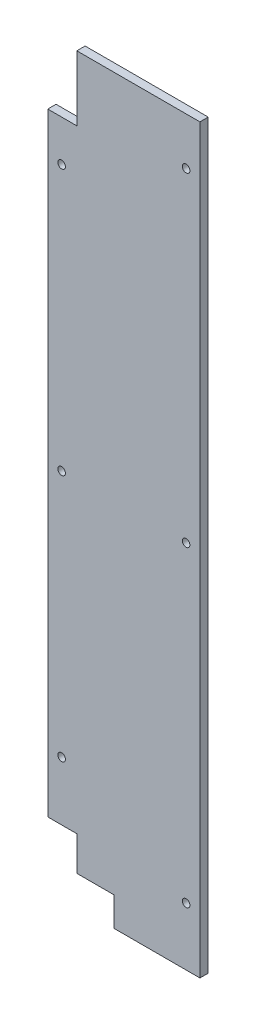
ISO-10303-21;
HEADER;
FILE_DESCRIPTION(('STEP AP214'),'2;1');
FILE_NAME('part.step','',(''),(''),'','','');
FILE_SCHEMA(('AUTOMOTIVE_DESIGN { 1 0 10303 214 1 1 1 1 }'));
ENDSEC;
DATA;
#1=APPLICATION_CONTEXT('core data for automotive mechanical design processes');
#2=APPLICATION_PROTOCOL_DEFINITION('international standard','automotive_design',2000,#1);
#3=PRODUCT_CONTEXT('',#1,'mechanical');
#4=PRODUCT('Part','Part','',(#3));
#5=PRODUCT_RELATED_PRODUCT_CATEGORY('part','',(#4));
#6=PRODUCT_DEFINITION_FORMATION('','',#4);
#7=PRODUCT_DEFINITION_CONTEXT('part definition',#1,'design');
#8=PRODUCT_DEFINITION('design','',#6,#7);
#9=PRODUCT_DEFINITION_SHAPE('','',#8);
#10=(LENGTH_UNIT() NAMED_UNIT(*) SI_UNIT(.MILLI.,.METRE.));
#11=(NAMED_UNIT(*) PLANE_ANGLE_UNIT() SI_UNIT($,.RADIAN.));
#12=(NAMED_UNIT(*) SI_UNIT($,.STERADIAN.) SOLID_ANGLE_UNIT());
#13=UNCERTAINTY_MEASURE_WITH_UNIT(LENGTH_MEASURE(1.E-05),#10,'distance_accuracy_value','');
#14=(GEOMETRIC_REPRESENTATION_CONTEXT(3) GLOBAL_UNCERTAINTY_ASSIGNED_CONTEXT((#13)) GLOBAL_UNIT_ASSIGNED_CONTEXT((#10,
#11,#12)) REPRESENTATION_CONTEXT('',''));
#15=CARTESIAN_POINT('',(0.,0.,0.));
#16=DIRECTION('',(0.,0.,1.));
#17=DIRECTION('',(1.,0.,0.));
#18=AXIS2_PLACEMENT_3D('',#15,#16,#17);
#19=CARTESIAN_POINT('',(-109.419020992965,162.175301007237,6.));
#20=DIRECTION('',(-1.,0.,0.));
#21=DIRECTION('',(0.,-1.,0.));
#22=AXIS2_PLACEMENT_3D('',#19,#20,#21);
#23=PLANE('',#22);
#24=DIRECTION('',(0.,1.,0.));
#25=VECTOR('',#24,1.);
#26=CARTESIAN_POINT('',(-109.419020992965,162.175301007237,0.));
#27=LINE('',#26,#25);
#28=CARTESIAN_POINT('',(-109.419020992965,162.175301007237,0.));
#29=VERTEX_POINT('',#28);
#30=CARTESIAN_POINT('',(-109.419020992965,209.144261643741,0.));
#31=VERTEX_POINT('',#30);
#32=EDGE_CURVE('E142',#29,#31,#27,.T.);
#33=ORIENTED_EDGE('',*,*,#32,.F.);
#34=DIRECTION('',(0.,0.,-1.));
#35=VECTOR('',#34,1.);
#36=CARTESIAN_POINT('',(-109.419020992965,162.175301007237,6.));
#37=LINE('',#36,#35);
#38=CARTESIAN_POINT('',(-109.419020992965,162.175301007237,6.));
#39=VERTEX_POINT('',#38);
#40=EDGE_CURVE('E11',#39,#29,#37,.T.);
#41=ORIENTED_EDGE('',*,*,#40,.F.);
#42=DIRECTION('',(0.,1.,0.));
#43=VECTOR('',#42,1.);
#44=CARTESIAN_POINT('',(-109.419020992965,162.175301007237,6.));
#45=LINE('',#44,#43);
#46=CARTESIAN_POINT('',(-109.419020992965,209.144261643741,6.));
#47=VERTEX_POINT('',#46);
#48=EDGE_CURVE('E169',#39,#47,#45,.T.);
#49=ORIENTED_EDGE('',*,*,#48,.T.);
#50=DIRECTION('',(0.,0.,-1.));
#51=VECTOR('',#50,1.);
#52=CARTESIAN_POINT('',(-109.419020992965,209.144261643741,6.));
#53=LINE('',#52,#51);
#54=EDGE_CURVE('E94',#47,#31,#53,.T.);
#55=ORIENTED_EDGE('',*,*,#54,.T.);
#56=EDGE_LOOP('',(#33,#41,#49,#55));
#57=FACE_BOUND('',#56,.T.);
#58=ADVANCED_FACE('F33',(#57),#23,.T.);
#59=CARTESIAN_POINT('',(-130.419020992965,162.175301007237,6.));
#60=DIRECTION('',(0.,1.,0.));
#61=DIRECTION('',(0.,0.,1.));
#62=AXIS2_PLACEMENT_3D('',#59,#60,#61);
#63=PLANE('',#62);
#64=DIRECTION('',(1.,0.,0.));
#65=VECTOR('',#64,1.);
#66=CARTESIAN_POINT('',(-130.419020992965,162.175301007237,0.));
#67=LINE('',#66,#65);
#68=CARTESIAN_POINT('',(-130.419020992965,162.175301007237,0.));
#69=VERTEX_POINT('',#68);
#70=EDGE_CURVE('E167',#69,#29,#67,.T.);
#71=ORIENTED_EDGE('',*,*,#70,.F.);
#72=DIRECTION('',(0.,0.,-1.));
#73=VECTOR('',#72,1.);
#74=CARTESIAN_POINT('',(-130.419020992965,162.175301007237,6.));
#75=LINE('',#74,#73);
#76=CARTESIAN_POINT('',(-130.419020992965,162.175301007237,6.));
#77=VERTEX_POINT('',#76);
#78=EDGE_CURVE('E42',#77,#69,#75,.T.);
#79=ORIENTED_EDGE('',*,*,#78,.F.);
#80=DIRECTION('',(1.,0.,0.));
#81=VECTOR('',#80,1.);
#82=CARTESIAN_POINT('',(-130.419020992965,162.175301007237,6.));
#83=LINE('',#82,#81);
#84=EDGE_CURVE('E122',#77,#39,#83,.T.);
#85=ORIENTED_EDGE('',*,*,#84,.T.);
#86=ORIENTED_EDGE('',*,*,#40,.T.);
#87=EDGE_LOOP('',(#71,#79,#85,#86));
#88=FACE_BOUND('',#87,.T.);
#89=ADVANCED_FACE('F243',(#88),#63,.T.);
#90=CARTESIAN_POINT('',(-130.419020992965,162.175301007237,6.));
#91=DIRECTION('',(1.,0.,0.));
#92=DIRECTION('',(0.,1.,0.));
#93=AXIS2_PLACEMENT_3D('',#90,#91,#92);
#94=PLANE('',#93);
#95=DIRECTION('',(0.,-1.,0.));
#96=VECTOR('',#95,1.);
#97=CARTESIAN_POINT('',(-130.419020992965,162.175301007237,0.));
#98=LINE('',#97,#96);
#99=CARTESIAN_POINT('',(-130.419020992965,-281.026923500086,0.));
#100=VERTEX_POINT('',#99);
#101=EDGE_CURVE('E127',#69,#100,#98,.T.);
#102=ORIENTED_EDGE('',*,*,#101,.T.);
#103=DIRECTION('',(0.,0.,-1.));
#104=VECTOR('',#103,1.);
#105=CARTESIAN_POINT('',(-130.419020992965,-281.026923500086,6.));
#106=LINE('',#105,#104);
#107=CARTESIAN_POINT('',(-130.419020992965,-281.026923500086,6.));
#108=VERTEX_POINT('',#107);
#109=EDGE_CURVE('E125',#108,#100,#106,.T.);
#110=ORIENTED_EDGE('',*,*,#109,.F.);
#111=DIRECTION('',(0.,-1.,0.));
#112=VECTOR('',#111,1.);
#113=CARTESIAN_POINT('',(-130.419020992965,162.175301007237,6.));
#114=LINE('',#113,#112);
#115=EDGE_CURVE('E116',#77,#108,#114,.T.);
#116=ORIENTED_EDGE('',*,*,#115,.F.);
#117=ORIENTED_EDGE('',*,*,#78,.T.);
#118=EDGE_LOOP('',(#102,#110,#116,#117));
#119=FACE_BOUND('',#118,.T.);
#120=ADVANCED_FACE('F126',(#119),#94,.F.);
#121=CARTESIAN_POINT('',(-130.419020992965,-281.026923500086,6.));
#122=DIRECTION('',(0.,1.,0.));
#123=DIRECTION('',(-1.,0.,0.));
#124=AXIS2_PLACEMENT_3D('',#121,#122,#123);
#125=PLANE('',#124);
#126=DIRECTION('',(1.,0.,0.));
#127=VECTOR('',#126,1.);
#128=CARTESIAN_POINT('',(-130.419020992965,-281.026923500086,0.));
#129=LINE('',#128,#127);
#130=CARTESIAN_POINT('',(-109.419020992965,-281.026923500086,0.));
#131=VERTEX_POINT('',#130);
#132=EDGE_CURVE('E164',#100,#131,#129,.T.);
#133=ORIENTED_EDGE('',*,*,#132,.T.);
#134=DIRECTION('',(0.,0.,-1.));
#135=VECTOR('',#134,1.);
#136=CARTESIAN_POINT('',(-109.419020992965,-281.026923500086,6.));
#137=LINE('',#136,#135);
#138=CARTESIAN_POINT('',(-109.419020992965,-281.026923500086,6.));
#139=VERTEX_POINT('',#138);
#140=EDGE_CURVE('E130',#139,#131,#137,.T.);
#141=ORIENTED_EDGE('',*,*,#140,.F.);
#142=DIRECTION('',(1.,0.,0.));
#143=VECTOR('',#142,1.);
#144=CARTESIAN_POINT('',(-130.419020992965,-281.026923500086,6.));
#145=LINE('',#144,#143);
#146=EDGE_CURVE('E120',#108,#139,#145,.T.);
#147=ORIENTED_EDGE('',*,*,#146,.F.);
#148=ORIENTED_EDGE('',*,*,#109,.T.);
#149=EDGE_LOOP('',(#133,#141,#147,#148));
#150=FACE_BOUND('',#149,.T.);
#151=ADVANCED_FACE('F132',(#150),#125,.F.);
#152=CARTESIAN_POINT('',(-109.419020992965,-281.026923500086,6.));
#153=DIRECTION('',(1.,0.,0.));
#154=DIRECTION('',(0.,0.,-1.));
#155=AXIS2_PLACEMENT_3D('',#152,#153,#154);
#156=PLANE('',#155);
#157=DIRECTION('',(0.,-1.,0.));
#158=VECTOR('',#157,1.);
#159=CARTESIAN_POINT('',(-109.419020992965,-281.026923500086,0.));
#160=LINE('',#159,#158);
#161=CARTESIAN_POINT('',(-109.419020992965,-305.855738356259,0.));
#162=VERTEX_POINT('',#161);
#163=EDGE_CURVE('E161',#131,#162,#160,.T.);
#164=ORIENTED_EDGE('',*,*,#163,.T.);
#165=DIRECTION('',(0.,0.,-1.));
#166=VECTOR('',#165,1.);
#167=CARTESIAN_POINT('',(-109.419020992965,-305.855738356259,6.));
#168=LINE('',#167,#166);
#169=CARTESIAN_POINT('',(-109.419020992965,-305.855738356259,6.));
#170=VERTEX_POINT('',#169);
#171=EDGE_CURVE('E173',#170,#162,#168,.T.);
#172=ORIENTED_EDGE('',*,*,#171,.F.);
#173=DIRECTION('',(0.,-1.,0.));
#174=VECTOR('',#173,1.);
#175=CARTESIAN_POINT('',(-109.419020992965,-281.026923500086,6.));
#176=LINE('',#175,#174);
#177=EDGE_CURVE('E135',#139,#170,#176,.T.);
#178=ORIENTED_EDGE('',*,*,#177,.F.);
#179=ORIENTED_EDGE('',*,*,#140,.T.);
#180=EDGE_LOOP('',(#164,#172,#178,#179));
#181=FACE_BOUND('',#180,.T.);
#182=ADVANCED_FACE('F256',(#181),#156,.F.);
#183=CARTESIAN_POINT('',(-82.4190209929646,-305.855738356259,6.));
#184=DIRECTION('',(0.,-1.,0.));
#185=DIRECTION('',(0.,0.,-1.));
#186=AXIS2_PLACEMENT_3D('',#183,#184,#185);
#187=PLANE('',#186);
#188=DIRECTION('',(-1.,0.,0.));
#189=VECTOR('',#188,1.);
#190=CARTESIAN_POINT('',(-82.4190209929646,-305.855738356259,0.));
#191=LINE('',#190,#189);
#192=CARTESIAN_POINT('',(-82.4190209929646,-305.855738356259,0.));
#193=VERTEX_POINT('',#192);
#194=EDGE_CURVE('E158',#193,#162,#191,.T.);
#195=ORIENTED_EDGE('',*,*,#194,.F.);
#196=DIRECTION('',(0.,0.,-1.));
#197=VECTOR('',#196,1.);
#198=CARTESIAN_POINT('',(-82.4190209929646,-305.855738356259,6.));
#199=LINE('',#198,#197);
#200=CARTESIAN_POINT('',(-82.4190209929646,-305.855738356259,6.));
#201=VERTEX_POINT('',#200);
#202=EDGE_CURVE('E175',#201,#193,#199,.T.);
#203=ORIENTED_EDGE('',*,*,#202,.F.);
#204=DIRECTION('',(-1.,0.,0.));
#205=VECTOR('',#204,1.);
#206=CARTESIAN_POINT('',(-82.4190209929646,-305.855738356259,6.));
#207=LINE('',#206,#205);
#208=EDGE_CURVE('E137',#201,#170,#207,.T.);
#209=ORIENTED_EDGE('',*,*,#208,.T.);
#210=ORIENTED_EDGE('',*,*,#171,.T.);
#211=EDGE_LOOP('',(#195,#203,#209,#210));
#212=FACE_BOUND('',#211,.T.);
#213=ADVANCED_FACE('F225',(#212),#187,.T.);
#214=CARTESIAN_POINT('',(-82.4190209929646,-326.855738356259,6.));
#215=DIRECTION('',(-1.,0.,0.));
#216=DIRECTION('',(0.,-1.,0.));
#217=AXIS2_PLACEMENT_3D('',#214,#215,#216);
#218=PLANE('',#217);
#219=DIRECTION('',(0.,1.,0.));
#220=VECTOR('',#219,1.);
#221=CARTESIAN_POINT('',(-82.4190209929646,-326.855738356259,0.));
#222=LINE('',#221,#220);
#223=CARTESIAN_POINT('',(-82.4190209929646,-326.855738356259,0.));
#224=VERTEX_POINT('',#223);
#225=EDGE_CURVE('E155',#224,#193,#222,.T.);
#226=ORIENTED_EDGE('',*,*,#225,.F.);
#227=DIRECTION('',(0.,0.,-1.));
#228=VECTOR('',#227,1.);
#229=CARTESIAN_POINT('',(-82.4190209929646,-326.855738356259,6.));
#230=LINE('',#229,#228);
#231=CARTESIAN_POINT('',(-82.4190209929646,-326.855738356259,6.));
#232=VERTEX_POINT('',#231);
#233=EDGE_CURVE('E177',#232,#224,#230,.T.);
#234=ORIENTED_EDGE('',*,*,#233,.F.);
#235=DIRECTION('',(0.,1.,0.));
#236=VECTOR('',#235,1.);
#237=CARTESIAN_POINT('',(-82.4190209929646,-326.855738356259,6.));
#238=LINE('',#237,#236);
#239=EDGE_CURVE('E219',#232,#201,#238,.T.);
#240=ORIENTED_EDGE('',*,*,#239,.T.);
#241=ORIENTED_EDGE('',*,*,#202,.T.);
#242=EDGE_LOOP('',(#226,#234,#240,#241));
#243=FACE_BOUND('',#242,.T.);
#244=ADVANCED_FACE('F230',(#243),#218,.T.);
#245=CARTESIAN_POINT('',(-82.4190209929646,-326.855738356259,6.));
#246=DIRECTION('',(0.,1.,0.));
#247=DIRECTION('',(0.,0.,1.));
#248=AXIS2_PLACEMENT_3D('',#245,#246,#247);
#249=PLANE('',#248);
#250=DIRECTION('',(1.,0.,0.));
#251=VECTOR('',#250,1.);
#252=CARTESIAN_POINT('',(-82.4190209929646,-326.855738356259,0.));
#253=LINE('',#252,#251);
#254=CARTESIAN_POINT('',(-20.4190209929647,-326.855738356259,0.));
#255=VERTEX_POINT('',#254);
#256=EDGE_CURVE('E152',#224,#255,#253,.T.);
#257=ORIENTED_EDGE('',*,*,#256,.T.);
#258=DIRECTION('',(0.,0.,-1.));
#259=VECTOR('',#258,1.);
#260=CARTESIAN_POINT('',(-20.4190209929647,-326.855738356259,6.));
#261=LINE('',#260,#259);
#262=CARTESIAN_POINT('',(-20.4190209929647,-326.855738356259,6.));
#263=VERTEX_POINT('',#262);
#264=EDGE_CURVE('E179',#263,#255,#261,.T.);
#265=ORIENTED_EDGE('',*,*,#264,.F.);
#266=DIRECTION('',(1.,0.,0.));
#267=VECTOR('',#266,1.);
#268=CARTESIAN_POINT('',(-82.4190209929646,-326.855738356259,6.));
#269=LINE('',#268,#267);
#270=EDGE_CURVE('E217',#232,#263,#269,.T.);
#271=ORIENTED_EDGE('',*,*,#270,.F.);
#272=ORIENTED_EDGE('',*,*,#233,.T.);
#273=EDGE_LOOP('',(#257,#265,#271,#272));
#274=FACE_BOUND('',#273,.T.);
#275=ADVANCED_FACE('F235',(#274),#249,.F.);
#276=CARTESIAN_POINT('',(-20.4190209929647,209.144261643741,6.));
#277=DIRECTION('',(1.,0.,0.));
#278=DIRECTION('',(0.,0.,-1.));
#279=AXIS2_PLACEMENT_3D('',#276,#277,#278);
#280=PLANE('',#279);
#281=DIRECTION('',(0.,-1.,0.));
#282=VECTOR('',#281,1.);
#283=CARTESIAN_POINT('',(-20.4190209929647,209.144261643741,0.));
#284=LINE('',#283,#282);
#285=CARTESIAN_POINT('',(-20.4190209929647,209.144261643741,0.));
#286=VERTEX_POINT('',#285);
#287=EDGE_CURVE('E149',#286,#255,#284,.T.);
#288=ORIENTED_EDGE('',*,*,#287,.F.);
#289=DIRECTION('',(0.,0.,-1.));
#290=VECTOR('',#289,1.);
#291=CARTESIAN_POINT('',(-20.4190209929647,209.144261643741,6.));
#292=LINE('',#291,#290);
#293=CARTESIAN_POINT('',(-20.4190209929647,209.144261643741,6.));
#294=VERTEX_POINT('',#293);
#295=EDGE_CURVE('E181',#294,#286,#292,.T.);
#296=ORIENTED_EDGE('',*,*,#295,.F.);
#297=DIRECTION('',(0.,-1.,0.));
#298=VECTOR('',#297,1.);
#299=CARTESIAN_POINT('',(-20.4190209929647,209.144261643741,6.));
#300=LINE('',#299,#298);
#301=EDGE_CURVE('E214',#294,#263,#300,.T.);
#302=ORIENTED_EDGE('',*,*,#301,.T.);
#303=ORIENTED_EDGE('',*,*,#264,.T.);
#304=EDGE_LOOP('',(#288,#296,#302,#303));
#305=FACE_BOUND('',#304,.T.);
#306=ADVANCED_FACE('F240',(#305),#280,.T.);
#307=CARTESIAN_POINT('',(-109.419020992965,209.144261643741,6.));
#308=DIRECTION('',(0.,1.,0.));
#309=DIRECTION('',(0.,0.,1.));
#310=AXIS2_PLACEMENT_3D('',#307,#308,#309);
#311=PLANE('',#310);
#312=DIRECTION('',(1.,0.,0.));
#313=VECTOR('',#312,1.);
#314=CARTESIAN_POINT('',(-109.419020992965,209.144261643741,0.));
#315=LINE('',#314,#313);
#316=EDGE_CURVE('E145',#31,#286,#315,.T.);
#317=ORIENTED_EDGE('',*,*,#316,.F.);
#318=ORIENTED_EDGE('',*,*,#54,.F.);
#319=DIRECTION('',(1.,0.,0.));
#320=VECTOR('',#319,1.);
#321=CARTESIAN_POINT('',(-109.419020992965,209.144261643741,6.));
#322=LINE('',#321,#320);
#323=EDGE_CURVE('E212',#47,#294,#322,.T.);
#324=ORIENTED_EDGE('',*,*,#323,.T.);
#325=ORIENTED_EDGE('',*,*,#295,.T.);
#326=EDGE_LOOP('',(#317,#318,#324,#325));
#327=FACE_BOUND('',#326,.T.);
#328=ADVANCED_FACE('F238',(#327),#311,.T.);
#329=CARTESIAN_POINT('',(0.,0.,6.));
#330=DIRECTION('',(0.,0.,-1.));
#331=DIRECTION('',(-1.,0.,0.));
#332=AXIS2_PLACEMENT_3D('',#329,#330,#331);
#333=PLANE('',#332);
#334=CARTESIAN_POINT('',(-120.419020992965,132.455525642704,6.));
#335=DIRECTION('',(0.,0.,1.));
#336=DIRECTION('',(1.,0.,0.));
#337=AXIS2_PLACEMENT_3D('',#334,#335,#336);
#338=CIRCLE('',#337,2.75000000000001);
#339=CARTESIAN_POINT('',(-117.669020992965,132.455525642704,6.));
#340=VERTEX_POINT('',#339);
#341=EDGE_CURVE('E312',#340,#340,#338,.T.);
#342=ORIENTED_EDGE('',*,*,#341,.F.);
#343=EDGE_LOOP('',(#342));
#344=FACE_BOUND('',#343,.T.);
#345=CARTESIAN_POINT('',(-120.419020992965,-238.562803654392,6.));
#346=DIRECTION('',(0.,0.,1.));
#347=DIRECTION('',(1.,0.,0.));
#348=AXIS2_PLACEMENT_3D('',#345,#346,#347);
#349=CIRCLE('',#348,2.75000000000001);
#350=CARTESIAN_POINT('',(-117.669020992965,-238.562803654392,6.));
#351=VERTEX_POINT('',#350);
#352=EDGE_CURVE('E308',#351,#351,#349,.T.);
#353=ORIENTED_EDGE('',*,*,#352,.F.);
#354=EDGE_LOOP('',(#353));
#355=FACE_BOUND('',#354,.T.);
#356=CARTESIAN_POINT('',(-30.4190209929647,-284.937648355611,6.));
#357=DIRECTION('',(0.,0.,1.));
#358=DIRECTION('',(1.,0.,0.));
#359=AXIS2_PLACEMENT_3D('',#356,#357,#358);
#360=CIRCLE('',#359,2.75);
#361=CARTESIAN_POINT('',(-27.6690209929647,-284.937648355611,6.));
#362=VERTEX_POINT('',#361);
#363=EDGE_CURVE('E306',#362,#362,#360,.T.);
#364=ORIENTED_EDGE('',*,*,#363,.F.);
#365=EDGE_LOOP('',(#364));
#366=FACE_BOUND('',#365,.T.);
#367=CARTESIAN_POINT('',(-30.4190209929647,174.944215351791,6.));
#368=DIRECTION('',(0.,0.,1.));
#369=DIRECTION('',(1.,0.,0.));
#370=AXIS2_PLACEMENT_3D('',#367,#368,#369);
#371=CIRCLE('',#370,2.75);
#372=CARTESIAN_POINT('',(-27.6690209929647,174.944215351791,6.));
#373=VERTEX_POINT('',#372);
#374=EDGE_CURVE('E209',#373,#373,#371,.T.);
#375=ORIENTED_EDGE('',*,*,#374,.F.);
#376=EDGE_LOOP('',(#375));
#377=FACE_BOUND('',#376,.T.);
#378=CARTESIAN_POINT('',(-30.4190209929647,-59.4258112464244,6.));
#379=DIRECTION('',(0.,0.,1.));
#380=DIRECTION('',(1.,0.,0.));
#381=AXIS2_PLACEMENT_3D('',#378,#379,#380);
#382=CIRCLE('',#381,2.75);
#383=CARTESIAN_POINT('',(-27.6690209929647,-59.4258112464244,6.));
#384=VERTEX_POINT('',#383);
#385=EDGE_CURVE('E191',#384,#384,#382,.T.);
#386=ORIENTED_EDGE('',*,*,#385,.F.);
#387=EDGE_LOOP('',(#386));
#388=FACE_BOUND('',#387,.T.);
#389=CARTESIAN_POINT('',(-120.419020992965,-59.4258112464244,6.));
#390=DIRECTION('',(0.,0.,1.));
#391=DIRECTION('',(1.,0.,0.));
#392=AXIS2_PLACEMENT_3D('',#389,#390,#391);
#393=CIRCLE('',#392,2.75000000000001);
#394=CARTESIAN_POINT('',(-117.669020992965,-59.4258112464244,6.));
#395=VERTEX_POINT('',#394);
#396=EDGE_CURVE('E186',#395,#395,#393,.T.);
#397=ORIENTED_EDGE('',*,*,#396,.F.);
#398=EDGE_LOOP('',(#397));
#399=FACE_BOUND('',#398,.T.);
#400=ORIENTED_EDGE('',*,*,#48,.F.);
#401=ORIENTED_EDGE('',*,*,#84,.F.);
#402=ORIENTED_EDGE('',*,*,#115,.T.);
#403=ORIENTED_EDGE('',*,*,#146,.T.);
#404=ORIENTED_EDGE('',*,*,#177,.T.);
#405=ORIENTED_EDGE('',*,*,#208,.F.);
#406=ORIENTED_EDGE('',*,*,#239,.F.);
#407=ORIENTED_EDGE('',*,*,#270,.T.);
#408=ORIENTED_EDGE('',*,*,#301,.F.);
#409=ORIENTED_EDGE('',*,*,#323,.F.);
#410=EDGE_LOOP('',(#400,#401,#402,#403,#404,#405,#406,#407,#408,#409));
#411=FACE_BOUND('',#410,.T.);
#412=ADVANCED_FACE('F118',(#344,#355,#366,#377,#388,#399,#411),#333,.F.);
#413=CARTESIAN_POINT('',(0.,0.,0.));
#414=DIRECTION('',(0.,0.,-1.));
#415=DIRECTION('',(-1.,0.,0.));
#416=AXIS2_PLACEMENT_3D('',#413,#414,#415);
#417=PLANE('',#416);
#418=CARTESIAN_POINT('',(-120.419020992965,132.455525642704,0.));
#419=DIRECTION('',(0.,0.,-1.));
#420=DIRECTION('',(-1.,0.,0.));
#421=AXIS2_PLACEMENT_3D('',#418,#419,#420);
#422=CIRCLE('',#421,2.75000000000001);
#423=CARTESIAN_POINT('',(-123.169020992965,132.455525642704,0.));
#424=VERTEX_POINT('',#423);
#425=EDGE_CURVE('E36',#424,#424,#422,.T.);
#426=ORIENTED_EDGE('',*,*,#425,.F.);
#427=EDGE_LOOP('',(#426));
#428=FACE_BOUND('',#427,.T.);
#429=CARTESIAN_POINT('',(-120.419020992965,-238.562803654392,0.));
#430=DIRECTION('',(0.,0.,-1.));
#431=DIRECTION('',(-1.,0.,0.));
#432=AXIS2_PLACEMENT_3D('',#429,#430,#431);
#433=CIRCLE('',#432,2.75000000000001);
#434=CARTESIAN_POINT('',(-123.169020992965,-238.562803654392,0.));
#435=VERTEX_POINT('',#434);
#436=EDGE_CURVE('E196',#435,#435,#433,.T.);
#437=ORIENTED_EDGE('',*,*,#436,.F.);
#438=EDGE_LOOP('',(#437));
#439=FACE_BOUND('',#438,.T.);
#440=CARTESIAN_POINT('',(-30.4190209929647,-284.937648355611,0.));
#441=DIRECTION('',(0.,0.,-1.));
#442=DIRECTION('',(-1.,0.,0.));
#443=AXIS2_PLACEMENT_3D('',#440,#441,#442);
#444=CIRCLE('',#443,2.75);
#445=CARTESIAN_POINT('',(-33.1690209929647,-284.937648355611,0.));
#446=VERTEX_POINT('',#445);
#447=EDGE_CURVE('E194',#446,#446,#444,.T.);
#448=ORIENTED_EDGE('',*,*,#447,.F.);
#449=EDGE_LOOP('',(#448));
#450=FACE_BOUND('',#449,.T.);
#451=CARTESIAN_POINT('',(-30.4190209929647,174.944215351791,0.));
#452=DIRECTION('',(0.,0.,-1.));
#453=DIRECTION('',(-1.,0.,0.));
#454=AXIS2_PLACEMENT_3D('',#451,#452,#453);
#455=CIRCLE('',#454,2.75);
#456=CARTESIAN_POINT('',(-33.1690209929647,174.944215351791,0.));
#457=VERTEX_POINT('',#456);
#458=EDGE_CURVE('E190',#457,#457,#455,.T.);
#459=ORIENTED_EDGE('',*,*,#458,.F.);
#460=EDGE_LOOP('',(#459));
#461=FACE_BOUND('',#460,.T.);
#462=CARTESIAN_POINT('',(-30.4190209929647,-59.4258112464244,0.));
#463=DIRECTION('',(0.,0.,-1.));
#464=DIRECTION('',(-1.,0.,0.));
#465=AXIS2_PLACEMENT_3D('',#462,#463,#464);
#466=CIRCLE('',#465,2.75);
#467=CARTESIAN_POINT('',(-33.1690209929647,-59.4258112464244,0.));
#468=VERTEX_POINT('',#467);
#469=EDGE_CURVE('E187',#468,#468,#466,.T.);
#470=ORIENTED_EDGE('',*,*,#469,.F.);
#471=EDGE_LOOP('',(#470));
#472=FACE_BOUND('',#471,.T.);
#473=CARTESIAN_POINT('',(-120.419020992965,-59.4258112464244,0.));
#474=DIRECTION('',(0.,0.,-1.));
#475=DIRECTION('',(-1.,0.,0.));
#476=AXIS2_PLACEMENT_3D('',#473,#474,#475);
#477=CIRCLE('',#476,2.75000000000001);
#478=CARTESIAN_POINT('',(-123.169020992965,-59.4258112464244,0.));
#479=VERTEX_POINT('',#478);
#480=EDGE_CURVE('E146',#479,#479,#477,.T.);
#481=ORIENTED_EDGE('',*,*,#480,.F.);
#482=EDGE_LOOP('',(#481));
#483=FACE_BOUND('',#482,.T.);
#484=ORIENTED_EDGE('',*,*,#32,.T.);
#485=ORIENTED_EDGE('',*,*,#316,.T.);
#486=ORIENTED_EDGE('',*,*,#287,.T.);
#487=ORIENTED_EDGE('',*,*,#256,.F.);
#488=ORIENTED_EDGE('',*,*,#225,.T.);
#489=ORIENTED_EDGE('',*,*,#194,.T.);
#490=ORIENTED_EDGE('',*,*,#163,.F.);
#491=ORIENTED_EDGE('',*,*,#132,.F.);
#492=ORIENTED_EDGE('',*,*,#101,.F.);
#493=ORIENTED_EDGE('',*,*,#70,.T.);
#494=EDGE_LOOP('',(#484,#485,#486,#487,#488,#489,#490,#491,#492,#493));
#495=FACE_BOUND('',#494,.T.);
#496=ADVANCED_FACE('F242',(#428,#439,#450,#461,#472,#483,#495),#417,.T.);
#497=CARTESIAN_POINT('',(-120.419020992965,-59.4258112464244,-4.));
#498=DIRECTION('',(0.,0.,1.));
#499=DIRECTION('',(1.,0.,0.));
#500=AXIS2_PLACEMENT_3D('',#497,#498,#499);
#501=CYLINDRICAL_SURFACE('',#500,2.75000000000001);
#502=ORIENTED_EDGE('',*,*,#480,.T.);
#503=EDGE_LOOP('',(#502));
#504=FACE_BOUND('',#503,.T.);
#505=ORIENTED_EDGE('',*,*,#396,.T.);
#506=EDGE_LOOP('',(#505));
#507=FACE_BOUND('',#506,.T.);
#508=ADVANCED_FACE('F275',(#504,#507),#501,.F.);
#509=CARTESIAN_POINT('',(-30.4190209929647,-59.4258112464244,-4.));
#510=DIRECTION('',(0.,0.,1.));
#511=DIRECTION('',(1.,0.,0.));
#512=AXIS2_PLACEMENT_3D('',#509,#510,#511);
#513=CYLINDRICAL_SURFACE('',#512,2.75);
#514=ORIENTED_EDGE('',*,*,#469,.T.);
#515=EDGE_LOOP('',(#514));
#516=FACE_BOUND('',#515,.T.);
#517=ORIENTED_EDGE('',*,*,#385,.T.);
#518=EDGE_LOOP('',(#517));
#519=FACE_BOUND('',#518,.T.);
#520=ADVANCED_FACE('F282',(#516,#519),#513,.F.);
#521=CARTESIAN_POINT('',(-30.4190209929647,174.944215351791,-4.));
#522=DIRECTION('',(0.,0.,1.));
#523=DIRECTION('',(1.,0.,0.));
#524=AXIS2_PLACEMENT_3D('',#521,#522,#523);
#525=CYLINDRICAL_SURFACE('',#524,2.75);
#526=ORIENTED_EDGE('',*,*,#458,.T.);
#527=EDGE_LOOP('',(#526));
#528=FACE_BOUND('',#527,.T.);
#529=ORIENTED_EDGE('',*,*,#374,.T.);
#530=EDGE_LOOP('',(#529));
#531=FACE_BOUND('',#530,.T.);
#532=ADVANCED_FACE('F284',(#528,#531),#525,.F.);
#533=CARTESIAN_POINT('',(-30.4190209929647,-284.937648355611,-4.));
#534=DIRECTION('',(0.,0.,1.));
#535=DIRECTION('',(1.,0.,0.));
#536=AXIS2_PLACEMENT_3D('',#533,#534,#535);
#537=CYLINDRICAL_SURFACE('',#536,2.75);
#538=ORIENTED_EDGE('',*,*,#447,.T.);
#539=EDGE_LOOP('',(#538));
#540=FACE_BOUND('',#539,.T.);
#541=ORIENTED_EDGE('',*,*,#363,.T.);
#542=EDGE_LOOP('',(#541));
#543=FACE_BOUND('',#542,.T.);
#544=ADVANCED_FACE('F287',(#540,#543),#537,.F.);
#545=CARTESIAN_POINT('',(-120.419020992965,-238.562803654392,-4.));
#546=DIRECTION('',(0.,0.,1.));
#547=DIRECTION('',(1.,0.,0.));
#548=AXIS2_PLACEMENT_3D('',#545,#546,#547);
#549=CYLINDRICAL_SURFACE('',#548,2.75000000000001);
#550=ORIENTED_EDGE('',*,*,#436,.T.);
#551=EDGE_LOOP('',(#550));
#552=FACE_BOUND('',#551,.T.);
#553=ORIENTED_EDGE('',*,*,#352,.T.);
#554=EDGE_LOOP('',(#553));
#555=FACE_BOUND('',#554,.T.);
#556=ADVANCED_FACE('F295',(#552,#555),#549,.F.);
#557=CARTESIAN_POINT('',(-120.419020992965,132.455525642704,-4.));
#558=DIRECTION('',(0.,0.,1.));
#559=DIRECTION('',(1.,0.,0.));
#560=AXIS2_PLACEMENT_3D('',#557,#558,#559);
#561=CYLINDRICAL_SURFACE('',#560,2.75000000000001);
#562=ORIENTED_EDGE('',*,*,#425,.T.);
#563=EDGE_LOOP('',(#562));
#564=FACE_BOUND('',#563,.T.);
#565=ORIENTED_EDGE('',*,*,#341,.T.);
#566=EDGE_LOOP('',(#565));
#567=FACE_BOUND('',#566,.T.);
#568=ADVANCED_FACE('F292',(#564,#567),#561,.F.);
#569=CLOSED_SHELL('',(#58,#89,#120,#151,#182,#213,#244,#275,#306,#328,#412,#496,#508,#520,#532,
#544,#556,#568));
#570=MANIFOLD_SOLID_BREP('B2',#569);
#571=ADVANCED_BREP_SHAPE_REPRESENTATION('',(#18,#570),#14);
#572=SHAPE_DEFINITION_REPRESENTATION(#9,#571);
ENDSEC;
END-ISO-10303-21;
